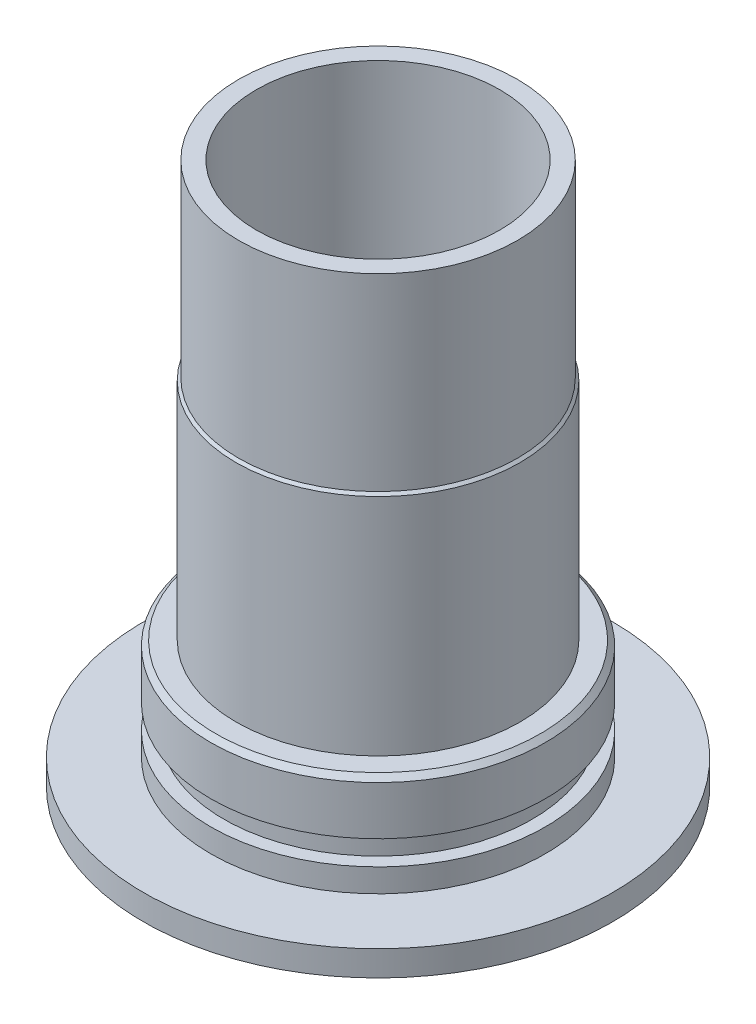
ISO-10303-21;
HEADER;
FILE_DESCRIPTION(('STEP AP214'),'2;1');
FILE_NAME('part.step','',(''),(''),'','','');
FILE_SCHEMA(('AUTOMOTIVE_DESIGN { 1 0 10303 214 1 1 1 1 }'));
ENDSEC;
DATA;
#1=APPLICATION_CONTEXT('core data for automotive mechanical design processes');
#2=APPLICATION_PROTOCOL_DEFINITION('international standard','automotive_design',2000,#1);
#3=PRODUCT_CONTEXT('',#1,'mechanical');
#4=PRODUCT('Part','Part','',(#3));
#5=PRODUCT_RELATED_PRODUCT_CATEGORY('part','',(#4));
#6=PRODUCT_DEFINITION_FORMATION('','',#4);
#7=PRODUCT_DEFINITION_CONTEXT('part definition',#1,'design');
#8=PRODUCT_DEFINITION('design','',#6,#7);
#9=PRODUCT_DEFINITION_SHAPE('','',#8);
#10=(LENGTH_UNIT() NAMED_UNIT(*) SI_UNIT(.MILLI.,.METRE.));
#11=(NAMED_UNIT(*) PLANE_ANGLE_UNIT() SI_UNIT($,.RADIAN.));
#12=(NAMED_UNIT(*) SI_UNIT($,.STERADIAN.) SOLID_ANGLE_UNIT());
#13=UNCERTAINTY_MEASURE_WITH_UNIT(LENGTH_MEASURE(1.E-05),#10,'distance_accuracy_value','');
#14=(GEOMETRIC_REPRESENTATION_CONTEXT(3) GLOBAL_UNCERTAINTY_ASSIGNED_CONTEXT((#13)) GLOBAL_UNIT_ASSIGNED_CONTEXT((#10,
#11,#12)) REPRESENTATION_CONTEXT('',''));
#15=CARTESIAN_POINT('',(0.,0.,0.));
#16=DIRECTION('',(0.,0.,1.));
#17=DIRECTION('',(1.,0.,0.));
#18=AXIS2_PLACEMENT_3D('',#15,#16,#17);
#19=CARTESIAN_POINT('',(0.,0.,0.));
#20=DIRECTION('',(0.,-1.,0.));
#21=DIRECTION('',(0.,0.,-1.));
#22=AXIS2_PLACEMENT_3D('',#19,#20,#21);
#23=CYLINDRICAL_SURFACE('',#22,24.);
#24=CARTESIAN_POINT('',(0.,0.,0.));
#25=DIRECTION('',(0.,-1.,0.));
#26=DIRECTION('',(0.,0.,-1.));
#27=AXIS2_PLACEMENT_3D('',#24,#25,#26);
#28=CIRCLE('',#27,24.);
#29=CARTESIAN_POINT('',(0.,0.,-24.));
#30=VERTEX_POINT('',#29);
#31=EDGE_CURVE('E85',#30,#30,#28,.T.);
#32=ORIENTED_EDGE('',*,*,#31,.T.);
#33=EDGE_LOOP('',(#32));
#34=FACE_BOUND('',#33,.T.);
#35=CARTESIAN_POINT('',(0.,107.,0.));
#36=DIRECTION('',(0.,1.,0.));
#37=DIRECTION('',(0.,0.,1.));
#38=AXIS2_PLACEMENT_3D('',#35,#36,#37);
#39=CIRCLE('',#38,24.);
#40=CARTESIAN_POINT('',(0.,107.,24.));
#41=VERTEX_POINT('',#40);
#42=EDGE_CURVE('E88',#41,#41,#39,.T.);
#43=ORIENTED_EDGE('',*,*,#42,.T.);
#44=EDGE_LOOP('',(#43));
#45=FACE_BOUND('',#44,.T.);
#46=ADVANCED_FACE('F33',(#34,#45),#23,.F.);
#47=CARTESIAN_POINT('',(0.,0.,0.));
#48=DIRECTION('',(0.,-1.,0.));
#49=DIRECTION('',(0.,0.,-1.));
#50=AXIS2_PLACEMENT_3D('',#47,#48,#49);
#51=CYLINDRICAL_SURFACE('',#50,27.5);
#52=CARTESIAN_POINT('',(0.,69.8,0.));
#53=DIRECTION('',(0.,-1.,0.));
#54=DIRECTION('',(0.,0.,-1.));
#55=AXIS2_PLACEMENT_3D('',#52,#53,#54);
#56=CIRCLE('',#55,27.5);
#57=CARTESIAN_POINT('',(0.,69.8,-27.5));
#58=VERTEX_POINT('',#57);
#59=EDGE_CURVE('E10',#58,#58,#56,.T.);
#60=ORIENTED_EDGE('',*,*,#59,.F.);
#61=EDGE_LOOP('',(#60));
#62=FACE_BOUND('',#61,.T.);
#63=CARTESIAN_POINT('',(0.,107.,0.));
#64=DIRECTION('',(0.,1.,0.));
#65=DIRECTION('',(0.,0.,1.));
#66=AXIS2_PLACEMENT_3D('',#63,#64,#65);
#67=CIRCLE('',#66,27.5);
#68=CARTESIAN_POINT('',(0.,107.,27.5));
#69=VERTEX_POINT('',#68);
#70=EDGE_CURVE('E36',#69,#69,#67,.F.);
#71=ORIENTED_EDGE('',*,*,#70,.T.);
#72=EDGE_LOOP('',(#71));
#73=FACE_BOUND('',#72,.T.);
#74=ADVANCED_FACE('F95',(#62,#73),#51,.T.);
#75=CARTESIAN_POINT('',(0.,69.3,0.));
#76=DIRECTION('',(0.,-1.,0.));
#77=DIRECTION('',(0.,0.,-1.));
#78=AXIS2_PLACEMENT_3D('',#75,#76,#77);
#79=CONICAL_SURFACE('',#78,28.,0.785398163397431);
#80=ORIENTED_EDGE('',*,*,#59,.T.);
#81=EDGE_LOOP('',(#80));
#82=FACE_BOUND('',#81,.T.);
#83=CARTESIAN_POINT('',(0.,69.3,0.));
#84=DIRECTION('',(0.,-1.,0.));
#85=DIRECTION('',(0.,0.,-1.));
#86=AXIS2_PLACEMENT_3D('',#83,#84,#85);
#87=CIRCLE('',#86,28.);
#88=CARTESIAN_POINT('',(0.,69.3,-28.));
#89=VERTEX_POINT('',#88);
#90=EDGE_CURVE('E40',#89,#89,#87,.T.);
#91=ORIENTED_EDGE('',*,*,#90,.F.);
#92=EDGE_LOOP('',(#91));
#93=FACE_BOUND('',#92,.T.);
#94=ADVANCED_FACE('F115',(#82,#93),#79,.T.);
#95=CARTESIAN_POINT('',(0.,0.,0.));
#96=DIRECTION('',(0.,-1.,0.));
#97=DIRECTION('',(0.,0.,-1.));
#98=AXIS2_PLACEMENT_3D('',#95,#96,#97);
#99=CYLINDRICAL_SURFACE('',#98,28.);
#100=ORIENTED_EDGE('',*,*,#90,.T.);
#101=EDGE_LOOP('',(#100));
#102=FACE_BOUND('',#101,.T.);
#103=CARTESIAN_POINT('',(0.,25.,0.));
#104=DIRECTION('',(0.,-1.,0.));
#105=DIRECTION('',(0.,0.,-1.));
#106=AXIS2_PLACEMENT_3D('',#103,#104,#105);
#107=CIRCLE('',#106,28.);
#108=CARTESIAN_POINT('',(0.,25.,-28.));
#109=VERTEX_POINT('',#108);
#110=EDGE_CURVE('E44',#109,#109,#107,.T.);
#111=ORIENTED_EDGE('',*,*,#110,.F.);
#112=EDGE_LOOP('',(#111));
#113=FACE_BOUND('',#112,.T.);
#114=ADVANCED_FACE('F122',(#102,#113),#99,.T.);
#115=CARTESIAN_POINT('',(28.,25.,0.));
#116=DIRECTION('',(0.,1.,0.));
#117=DIRECTION('',(0.,0.,1.));
#118=AXIS2_PLACEMENT_3D('',#115,#116,#117);
#119=PLANE('',#118);
#120=ORIENTED_EDGE('',*,*,#110,.T.);
#121=EDGE_LOOP('',(#120));
#122=FACE_BOUND('',#121,.T.);
#123=CARTESIAN_POINT('',(0.,25.,0.));
#124=DIRECTION('',(0.,-1.,0.));
#125=DIRECTION('',(0.,0.,-1.));
#126=AXIS2_PLACEMENT_3D('',#123,#124,#125);
#127=CIRCLE('',#126,32.);
#128=CARTESIAN_POINT('',(0.,25.,-32.));
#129=VERTEX_POINT('',#128);
#130=EDGE_CURVE('E49',#129,#129,#127,.T.);
#131=ORIENTED_EDGE('',*,*,#130,.F.);
#132=EDGE_LOOP('',(#131));
#133=FACE_BOUND('',#132,.T.);
#134=ADVANCED_FACE('F127',(#122,#133),#119,.T.);
#135=CARTESIAN_POINT('',(0.,24.,0.));
#136=DIRECTION('',(0.,-1.,0.));
#137=DIRECTION('',(0.,0.,-1.));
#138=AXIS2_PLACEMENT_3D('',#135,#136,#137);
#139=CONICAL_SURFACE('',#138,33.,0.785398163397452);
#140=ORIENTED_EDGE('',*,*,#130,.T.);
#141=EDGE_LOOP('',(#140));
#142=FACE_BOUND('',#141,.T.);
#143=CARTESIAN_POINT('',(0.,24.,0.));
#144=DIRECTION('',(0.,-1.,0.));
#145=DIRECTION('',(0.,0.,-1.));
#146=AXIS2_PLACEMENT_3D('',#143,#144,#145);
#147=CIRCLE('',#146,33.);
#148=CARTESIAN_POINT('',(0.,24.,-33.));
#149=VERTEX_POINT('',#148);
#150=EDGE_CURVE('E52',#149,#149,#147,.T.);
#151=ORIENTED_EDGE('',*,*,#150,.F.);
#152=EDGE_LOOP('',(#151));
#153=FACE_BOUND('',#152,.T.);
#154=ADVANCED_FACE('F131',(#142,#153),#139,.T.);
#155=CARTESIAN_POINT('',(0.,0.,0.));
#156=DIRECTION('',(0.,-1.,0.));
#157=DIRECTION('',(0.,0.,-1.));
#158=AXIS2_PLACEMENT_3D('',#155,#156,#157);
#159=CYLINDRICAL_SURFACE('',#158,33.);
#160=ORIENTED_EDGE('',*,*,#150,.T.);
#161=EDGE_LOOP('',(#160));
#162=FACE_BOUND('',#161,.T.);
#163=CARTESIAN_POINT('',(0.,14.4,0.));
#164=DIRECTION('',(0.,-1.,0.));
#165=DIRECTION('',(0.,0.,-1.));
#166=AXIS2_PLACEMENT_3D('',#163,#164,#165);
#167=CIRCLE('',#166,33.);
#168=CARTESIAN_POINT('',(0.,14.4,-33.));
#169=VERTEX_POINT('',#168);
#170=EDGE_CURVE('E55',#169,#169,#167,.T.);
#171=ORIENTED_EDGE('',*,*,#170,.F.);
#172=EDGE_LOOP('',(#171));
#173=FACE_BOUND('',#172,.T.);
#174=ADVANCED_FACE('F135',(#162,#173),#159,.T.);
#175=CARTESIAN_POINT('',(33.,14.4,0.));
#176=DIRECTION('',(0.,-1.,0.));
#177=DIRECTION('',(0.,0.,-1.));
#178=AXIS2_PLACEMENT_3D('',#175,#176,#177);
#179=PLANE('',#178);
#180=ORIENTED_EDGE('',*,*,#170,.T.);
#181=EDGE_LOOP('',(#180));
#182=FACE_BOUND('',#181,.T.);
#183=CARTESIAN_POINT('',(0.,14.4,0.));
#184=DIRECTION('',(0.,-1.,0.));
#185=DIRECTION('',(0.,0.,-1.));
#186=AXIS2_PLACEMENT_3D('',#183,#184,#185);
#187=CIRCLE('',#186,30.4);
#188=CARTESIAN_POINT('',(0.,14.4,-30.4));
#189=VERTEX_POINT('',#188);
#190=EDGE_CURVE('E58',#189,#189,#187,.T.);
#191=ORIENTED_EDGE('',*,*,#190,.F.);
#192=EDGE_LOOP('',(#191));
#193=FACE_BOUND('',#192,.T.);
#194=ADVANCED_FACE('F139',(#182,#193),#179,.T.);
#195=CARTESIAN_POINT('',(0.,0.,0.));
#196=DIRECTION('',(0.,-1.,0.));
#197=DIRECTION('',(0.,0.,-1.));
#198=AXIS2_PLACEMENT_3D('',#195,#196,#197);
#199=CYLINDRICAL_SURFACE('',#198,30.4);
#200=ORIENTED_EDGE('',*,*,#190,.T.);
#201=EDGE_LOOP('',(#200));
#202=FACE_BOUND('',#201,.T.);
#203=CARTESIAN_POINT('',(0.,9.6,0.));
#204=DIRECTION('',(0.,-1.,0.));
#205=DIRECTION('',(0.,0.,-1.));
#206=AXIS2_PLACEMENT_3D('',#203,#204,#205);
#207=CIRCLE('',#206,30.4);
#208=CARTESIAN_POINT('',(0.,9.6,-30.4));
#209=VERTEX_POINT('',#208);
#210=EDGE_CURVE('E61',#209,#209,#207,.T.);
#211=ORIENTED_EDGE('',*,*,#210,.F.);
#212=EDGE_LOOP('',(#211));
#213=FACE_BOUND('',#212,.T.);
#214=ADVANCED_FACE('F143',(#202,#213),#199,.T.);
#215=CARTESIAN_POINT('',(30.4,9.6,0.));
#216=DIRECTION('',(0.,1.,0.));
#217=DIRECTION('',(0.,0.,1.));
#218=AXIS2_PLACEMENT_3D('',#215,#216,#217);
#219=PLANE('',#218);
#220=ORIENTED_EDGE('',*,*,#210,.T.);
#221=EDGE_LOOP('',(#220));
#222=FACE_BOUND('',#221,.T.);
#223=CARTESIAN_POINT('',(0.,9.6,0.));
#224=DIRECTION('',(0.,-1.,0.));
#225=DIRECTION('',(0.,0.,-1.));
#226=AXIS2_PLACEMENT_3D('',#223,#224,#225);
#227=CIRCLE('',#226,33.);
#228=CARTESIAN_POINT('',(0.,9.6,-33.));
#229=VERTEX_POINT('',#228);
#230=EDGE_CURVE('E64',#229,#229,#227,.T.);
#231=ORIENTED_EDGE('',*,*,#230,.F.);
#232=EDGE_LOOP('',(#231));
#233=FACE_BOUND('',#232,.T.);
#234=ADVANCED_FACE('F147',(#222,#233),#219,.T.);
#235=CARTESIAN_POINT('',(0.,0.,0.));
#236=DIRECTION('',(0.,-1.,0.));
#237=DIRECTION('',(0.,0.,-1.));
#238=AXIS2_PLACEMENT_3D('',#235,#236,#237);
#239=CYLINDRICAL_SURFACE('',#238,33.);
#240=ORIENTED_EDGE('',*,*,#230,.T.);
#241=EDGE_LOOP('',(#240));
#242=FACE_BOUND('',#241,.T.);
#243=CARTESIAN_POINT('',(0.,5.,0.));
#244=DIRECTION('',(0.,-1.,0.));
#245=DIRECTION('',(0.,0.,-1.));
#246=AXIS2_PLACEMENT_3D('',#243,#244,#245);
#247=CIRCLE('',#246,33.);
#248=CARTESIAN_POINT('',(0.,5.,-33.));
#249=VERTEX_POINT('',#248);
#250=EDGE_CURVE('E67',#249,#249,#247,.T.);
#251=ORIENTED_EDGE('',*,*,#250,.F.);
#252=EDGE_LOOP('',(#251));
#253=FACE_BOUND('',#252,.T.);
#254=ADVANCED_FACE('F151',(#242,#253),#239,.T.);
#255=CARTESIAN_POINT('',(33.,5.,0.));
#256=DIRECTION('',(0.,1.,0.));
#257=DIRECTION('',(0.,0.,1.));
#258=AXIS2_PLACEMENT_3D('',#255,#256,#257);
#259=PLANE('',#258);
#260=ORIENTED_EDGE('',*,*,#250,.T.);
#261=EDGE_LOOP('',(#260));
#262=FACE_BOUND('',#261,.T.);
#263=CARTESIAN_POINT('',(0.,5.,0.));
#264=DIRECTION('',(0.,-1.,0.));
#265=DIRECTION('',(0.,0.,-1.));
#266=AXIS2_PLACEMENT_3D('',#263,#264,#265);
#267=CIRCLE('',#266,46.25);
#268=CARTESIAN_POINT('',(0.,5.,-46.25));
#269=VERTEX_POINT('',#268);
#270=EDGE_CURVE('E70',#269,#269,#267,.T.);
#271=ORIENTED_EDGE('',*,*,#270,.F.);
#272=EDGE_LOOP('',(#271));
#273=FACE_BOUND('',#272,.T.);
#274=ADVANCED_FACE('F155',(#262,#273),#259,.T.);
#275=CARTESIAN_POINT('',(0.,0.,0.));
#276=DIRECTION('',(0.,-1.,0.));
#277=DIRECTION('',(0.,0.,-1.));
#278=AXIS2_PLACEMENT_3D('',#275,#276,#277);
#279=CYLINDRICAL_SURFACE('',#278,46.25);
#280=ORIENTED_EDGE('',*,*,#270,.T.);
#281=EDGE_LOOP('',(#280));
#282=FACE_BOUND('',#281,.T.);
#283=CARTESIAN_POINT('',(0.,0.,0.));
#284=DIRECTION('',(0.,-1.,0.));
#285=DIRECTION('',(0.,0.,-1.));
#286=AXIS2_PLACEMENT_3D('',#283,#284,#285);
#287=CIRCLE('',#286,46.25);
#288=CARTESIAN_POINT('',(0.,0.,-46.25));
#289=VERTEX_POINT('',#288);
#290=EDGE_CURVE('E73',#289,#289,#287,.T.);
#291=ORIENTED_EDGE('',*,*,#290,.F.);
#292=EDGE_LOOP('',(#291));
#293=FACE_BOUND('',#292,.T.);
#294=ADVANCED_FACE('F159',(#282,#293),#279,.T.);
#295=CARTESIAN_POINT('',(46.25,0.,0.));
#296=DIRECTION('',(0.,-1.,0.));
#297=DIRECTION('',(0.,0.,-1.));
#298=AXIS2_PLACEMENT_3D('',#295,#296,#297);
#299=PLANE('',#298);
#300=ORIENTED_EDGE('',*,*,#290,.T.);
#301=EDGE_LOOP('',(#300));
#302=FACE_BOUND('',#301,.T.);
#303=CARTESIAN_POINT('',(0.,0.,0.));
#304=DIRECTION('',(0.,-1.,0.));
#305=DIRECTION('',(0.,0.,-1.));
#306=AXIS2_PLACEMENT_3D('',#303,#304,#305);
#307=CIRCLE('',#306,26.775);
#308=CARTESIAN_POINT('',(0.,0.,-26.775));
#309=VERTEX_POINT('',#308);
#310=EDGE_CURVE('E76',#309,#309,#307,.T.);
#311=ORIENTED_EDGE('',*,*,#310,.F.);
#312=EDGE_LOOP('',(#311));
#313=FACE_BOUND('',#312,.T.);
#314=ADVANCED_FACE('F163',(#302,#313),#299,.T.);
#315=CARTESIAN_POINT('',(0.,0.499999999999998,0.));
#316=DIRECTION('',(0.,-1.,0.));
#317=DIRECTION('',(0.,0.,-1.));
#318=AXIS2_PLACEMENT_3D('',#315,#316,#317);
#319=CONICAL_SURFACE('',#318,26.35,0.704494064242216);
#320=ORIENTED_EDGE('',*,*,#310,.T.);
#321=EDGE_LOOP('',(#320));
#322=FACE_BOUND('',#321,.T.);
#323=CARTESIAN_POINT('',(0.,0.499999999999998,0.));
#324=DIRECTION('',(0.,-1.,0.));
#325=DIRECTION('',(0.,0.,-1.));
#326=AXIS2_PLACEMENT_3D('',#323,#324,#325);
#327=CIRCLE('',#326,26.35);
#328=CARTESIAN_POINT('',(0.,0.499999999999998,-26.35));
#329=VERTEX_POINT('',#328);
#330=EDGE_CURVE('E79',#329,#329,#327,.T.);
#331=ORIENTED_EDGE('',*,*,#330,.F.);
#332=EDGE_LOOP('',(#331));
#333=FACE_BOUND('',#332,.T.);
#334=ADVANCED_FACE('F167',(#322,#333),#319,.F.);
#335=CARTESIAN_POINT('',(0.,0.,0.));
#336=DIRECTION('',(0.,1.,0.));
#337=DIRECTION('',(0.,0.,1.));
#338=AXIS2_PLACEMENT_3D('',#335,#336,#337);
#339=CONICAL_SURFACE('',#338,25.925,0.704494064242216);
#340=ORIENTED_EDGE('',*,*,#330,.T.);
#341=EDGE_LOOP('',(#340));
#342=FACE_BOUND('',#341,.T.);
#343=CARTESIAN_POINT('',(0.,0.,0.));
#344=DIRECTION('',(0.,-1.,0.));
#345=DIRECTION('',(0.,0.,-1.));
#346=AXIS2_PLACEMENT_3D('',#343,#344,#345);
#347=CIRCLE('',#346,25.925);
#348=CARTESIAN_POINT('',(0.,0.,-25.925));
#349=VERTEX_POINT('',#348);
#350=EDGE_CURVE('E82',#349,#349,#347,.T.);
#351=ORIENTED_EDGE('',*,*,#350,.F.);
#352=EDGE_LOOP('',(#351));
#353=FACE_BOUND('',#352,.T.);
#354=ADVANCED_FACE('F106',(#342,#353),#339,.T.);
#355=CARTESIAN_POINT('',(25.925,0.,0.));
#356=DIRECTION('',(0.,-1.,0.));
#357=DIRECTION('',(0.,0.,-1.));
#358=AXIS2_PLACEMENT_3D('',#355,#356,#357);
#359=PLANE('',#358);
#360=ORIENTED_EDGE('',*,*,#350,.T.);
#361=EDGE_LOOP('',(#360));
#362=FACE_BOUND('',#361,.T.);
#363=ORIENTED_EDGE('',*,*,#31,.F.);
#364=EDGE_LOOP('',(#363));
#365=FACE_BOUND('',#364,.T.);
#366=ADVANCED_FACE('F99',(#362,#365),#359,.T.);
#367=CARTESIAN_POINT('',(0.,107.,0.));
#368=DIRECTION('',(0.,1.,0.));
#369=DIRECTION('',(0.,0.,1.));
#370=AXIS2_PLACEMENT_3D('',#367,#368,#369);
#371=PLANE('',#370);
#372=ORIENTED_EDGE('',*,*,#42,.F.);
#373=EDGE_LOOP('',(#372));
#374=FACE_BOUND('',#373,.T.);
#375=ORIENTED_EDGE('',*,*,#70,.F.);
#376=EDGE_LOOP('',(#375));
#377=FACE_BOUND('',#376,.T.);
#378=ADVANCED_FACE('F97',(#374,#377),#371,.T.);
#379=CLOSED_SHELL('',(#46,#74,#94,#114,#134,#154,#174,#194,#214,#234,#254,#274,#294,#314,#334,
#354,#366,#378));
#380=MANIFOLD_SOLID_BREP('B2',#379);
#381=ADVANCED_BREP_SHAPE_REPRESENTATION('',(#18,#380),#14);
#382=SHAPE_DEFINITION_REPRESENTATION(#9,#381);
ENDSEC;
END-ISO-10303-21;
